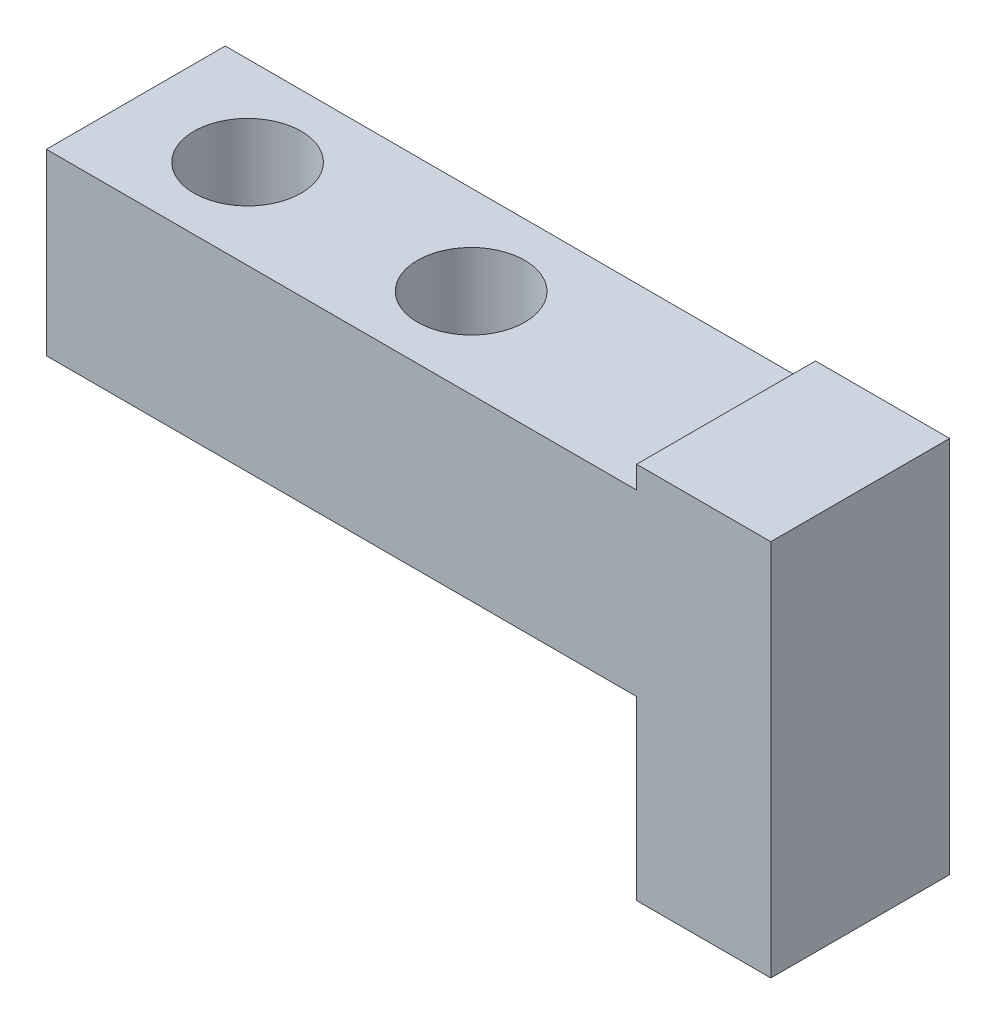
ISO-10303-21;
HEADER;
FILE_DESCRIPTION(('STEP AP214'),'2;1');
FILE_NAME('part.step','',(''),(''),'','','');
FILE_SCHEMA(('AUTOMOTIVE_DESIGN { 1 0 10303 214 1 1 1 1 }'));
ENDSEC;
DATA;
#1=APPLICATION_CONTEXT('core data for automotive mechanical design processes');
#2=APPLICATION_PROTOCOL_DEFINITION('international standard','automotive_design',2000,#1);
#3=PRODUCT_CONTEXT('',#1,'mechanical');
#4=PRODUCT('Part','Part','',(#3));
#5=PRODUCT_RELATED_PRODUCT_CATEGORY('part','',(#4));
#6=PRODUCT_DEFINITION_FORMATION('','',#4);
#7=PRODUCT_DEFINITION_CONTEXT('part definition',#1,'design');
#8=PRODUCT_DEFINITION('design','',#6,#7);
#9=PRODUCT_DEFINITION_SHAPE('','',#8);
#10=(LENGTH_UNIT() NAMED_UNIT(*) SI_UNIT(.MILLI.,.METRE.));
#11=(NAMED_UNIT(*) PLANE_ANGLE_UNIT() SI_UNIT($,.RADIAN.));
#12=(NAMED_UNIT(*) SI_UNIT($,.STERADIAN.) SOLID_ANGLE_UNIT());
#13=UNCERTAINTY_MEASURE_WITH_UNIT(LENGTH_MEASURE(1.E-05),#10,'distance_accuracy_value','');
#14=(GEOMETRIC_REPRESENTATION_CONTEXT(3) GLOBAL_UNCERTAINTY_ASSIGNED_CONTEXT((#13)) GLOBAL_UNIT_ASSIGNED_CONTEXT((#10,
#11,#12)) REPRESENTATION_CONTEXT('',''));
#15=CARTESIAN_POINT('',(0.,0.,0.));
#16=DIRECTION('',(0.,0.,1.));
#17=DIRECTION('',(1.,0.,0.));
#18=AXIS2_PLACEMENT_3D('',#15,#16,#17);
#19=CARTESIAN_POINT('',(-2.99999999999999,4.00000000000017,2.00000000000045));
#20=DIRECTION('',(0.999999999999974,0.,0.));
#21=DIRECTION('',(0.,0.,-0.999999999999992));
#22=AXIS2_PLACEMENT_3D('',#19,#20,#21);
#23=PLANE('',#22);
#24=DIRECTION('',(0.,-0.999999999999992,0.));
#25=VECTOR('',#24,1.);
#26=CARTESIAN_POINT('',(-3.00000000000054,3.99999999999923,-1.99999999999972));
#27=LINE('',#26,#25);
#28=CARTESIAN_POINT('',(-3.00000000000054,4.4999999999995,-2.00000000000011));
#29=VERTEX_POINT('',#28);
#30=CARTESIAN_POINT('',(-3.00000000000054,3.99999999999923,-1.99999999999972));
#31=VERTEX_POINT('',#30);
#32=EDGE_CURVE('E115',#29,#31,#27,.T.);
#33=ORIENTED_EDGE('',*,*,#32,.T.);
#34=DIRECTION('',(0.,0.,-0.999999999999992));
#35=VECTOR('',#34,1.);
#36=CARTESIAN_POINT('',(-2.99999999999999,4.00000000000017,2.00000000000045));
#37=LINE('',#36,#35);
#38=CARTESIAN_POINT('',(-2.99999999999999,4.00000000000017,2.00000000000045));
#39=VERTEX_POINT('',#38);
#40=EDGE_CURVE('E11',#39,#31,#37,.T.);
#41=ORIENTED_EDGE('',*,*,#40,.F.);
#42=DIRECTION('',(0.,-0.999999999999992,0.));
#43=VECTOR('',#42,1.);
#44=CARTESIAN_POINT('',(-2.99999999999999,4.00000000000017,2.00000000000045));
#45=LINE('',#44,#43);
#46=CARTESIAN_POINT('',(-2.99999999999999,4.49999999999956,2.00000000000033));
#47=VERTEX_POINT('',#46);
#48=EDGE_CURVE('E130',#47,#39,#45,.T.);
#49=ORIENTED_EDGE('',*,*,#48,.F.);
#50=DIRECTION('',(0.,0.,-0.999999999999992));
#51=VECTOR('',#50,1.);
#52=CARTESIAN_POINT('',(-2.99999999999999,4.49999999999956,2.00000000000033));
#53=LINE('',#52,#51);
#54=EDGE_CURVE('E111',#47,#29,#53,.T.);
#55=ORIENTED_EDGE('',*,*,#54,.T.);
#56=EDGE_LOOP('',(#33,#41,#49,#55));
#57=FACE_BOUND('',#56,.T.);
#58=ADVANCED_FACE('F17',(#57),#23,.F.);
#59=CARTESIAN_POINT('',(-16.1999999999989,4.00000000000006,2.00000000000017));
#60=DIRECTION('',(0.,-0.999999999999992,0.));
#61=DIRECTION('',(0.999999999999974,0.,0.));
#62=AXIS2_PLACEMENT_3D('',#59,#60,#61);
#63=PLANE('',#62);
#64=CARTESIAN_POINT('',(-8.7,3.99999999999995,-2.77555756156289E-13));
#65=DIRECTION('',(0.,0.999999999999992,0.));
#66=DIRECTION('',(0.,0.,0.999999999999992));
#67=AXIS2_PLACEMENT_3D('',#64,#65,#66);
#68=CIRCLE('',#67,1.2);
#69=CARTESIAN_POINT('',(-8.69999999999997,3.99999999999995,1.20000000000083));
#70=VERTEX_POINT('',#69);
#71=EDGE_CURVE('E150',#70,#70,#68,.T.);
#72=ORIENTED_EDGE('',*,*,#71,.F.);
#73=EDGE_LOOP('',(#72));
#74=FACE_BOUND('',#73,.T.);
#75=CARTESIAN_POINT('',(-13.6999999999995,3.99999999999934,-1.66533453693773E-13));
#76=DIRECTION('',(0.,0.999999999999992,0.));
#77=DIRECTION('',(0.,0.,0.999999999999992));
#78=AXIS2_PLACEMENT_3D('',#75,#76,#77);
#79=CIRCLE('',#78,1.2);
#80=CARTESIAN_POINT('',(-13.6999999999994,3.99999999999934,1.20000000000071));
#81=VERTEX_POINT('',#80);
#82=EDGE_CURVE('E142',#81,#81,#79,.T.);
#83=ORIENTED_EDGE('',*,*,#82,.F.);
#84=EDGE_LOOP('',(#83));
#85=FACE_BOUND('',#84,.T.);
#86=DIRECTION('',(-0.999999999999974,0.,0.));
#87=VECTOR('',#86,1.);
#88=CARTESIAN_POINT('',(-16.2,4.00000000000028,-2.00000000000006));
#89=LINE('',#88,#87);
#90=CARTESIAN_POINT('',(-16.2,4.00000000000028,-2.00000000000006));
#91=VERTEX_POINT('',#90);
#92=EDGE_CURVE('E118',#31,#91,#89,.T.);
#93=ORIENTED_EDGE('',*,*,#92,.T.);
#94=DIRECTION('',(0.,0.,-0.999999999999992));
#95=VECTOR('',#94,1.);
#96=CARTESIAN_POINT('',(-16.1999999999989,4.00000000000006,2.00000000000017));
#97=LINE('',#96,#95);
#98=CARTESIAN_POINT('',(-16.1999999999989,4.00000000000006,2.00000000000017));
#99=VERTEX_POINT('',#98);
#100=EDGE_CURVE('E26',#99,#91,#97,.T.);
#101=ORIENTED_EDGE('',*,*,#100,.F.);
#102=DIRECTION('',(-0.999999999999974,0.,0.));
#103=VECTOR('',#102,1.);
#104=CARTESIAN_POINT('',(-16.1999999999989,4.00000000000006,2.00000000000017));
#105=LINE('',#104,#103);
#106=EDGE_CURVE('E78',#39,#99,#105,.T.);
#107=ORIENTED_EDGE('',*,*,#106,.F.);
#108=ORIENTED_EDGE('',*,*,#40,.T.);
#109=EDGE_LOOP('',(#93,#101,#107,#108));
#110=FACE_BOUND('',#109,.T.);
#111=ADVANCED_FACE('F187',(#74,#85,#110),#63,.F.);
#112=CARTESIAN_POINT('',(-16.2,2.22044604925031E-13,1.99999999999895));
#113=DIRECTION('',(0.999999999999974,0.,0.));
#114=DIRECTION('',(0.,0.,-0.999999999999992));
#115=AXIS2_PLACEMENT_3D('',#112,#113,#114);
#116=PLANE('',#115);
#117=DIRECTION('',(0.,-0.999999999999992,0.));
#118=VECTOR('',#117,1.);
#119=CARTESIAN_POINT('',(-16.2,-1.66533453693773E-13,-1.99999999999984));
#120=LINE('',#119,#118);
#121=CARTESIAN_POINT('',(-16.2,-1.66533453693773E-13,-1.99999999999984));
#122=VERTEX_POINT('',#121);
#123=EDGE_CURVE('E121',#91,#122,#120,.T.);
#124=ORIENTED_EDGE('',*,*,#123,.T.);
#125=DIRECTION('',(0.,0.,-0.999999999999992));
#126=VECTOR('',#125,1.);
#127=CARTESIAN_POINT('',(-16.2,2.22044604925031E-13,1.99999999999895));
#128=LINE('',#127,#126);
#129=CARTESIAN_POINT('',(-16.2,2.22044604925031E-13,1.99999999999895));
#130=VERTEX_POINT('',#129);
#131=EDGE_CURVE('E137',#130,#122,#128,.T.);
#132=ORIENTED_EDGE('',*,*,#131,.F.);
#133=DIRECTION('',(0.,-0.999999999999992,0.));
#134=VECTOR('',#133,1.);
#135=CARTESIAN_POINT('',(-16.2,2.22044604925031E-13,1.99999999999895));
#136=LINE('',#135,#134);
#137=EDGE_CURVE('E155',#99,#130,#136,.T.);
#138=ORIENTED_EDGE('',*,*,#137,.F.);
#139=ORIENTED_EDGE('',*,*,#100,.T.);
#140=EDGE_LOOP('',(#124,#132,#138,#139));
#141=FACE_BOUND('',#140,.T.);
#142=ADVANCED_FACE('F191',(#141),#116,.F.);
#143=CARTESIAN_POINT('',(-3.00000000000054,0.,2.00000000000061));
#144=DIRECTION('',(0.,0.999999999999992,0.));
#145=DIRECTION('',(-0.999999999999974,0.,0.));
#146=AXIS2_PLACEMENT_3D('',#143,#144,#145);
#147=PLANE('',#146);
#148=CARTESIAN_POINT('',(-8.7,0.,0.));
#149=DIRECTION('',(0.,0.999999999999992,0.));
#150=DIRECTION('',(-0.999999999999974,0.,0.));
#151=AXIS2_PLACEMENT_3D('',#148,#149,#150);
#152=CIRCLE('',#151,1.2);
#153=CARTESIAN_POINT('',(-8.69999999999999,0.,1.20000000000082));
#154=VERTEX_POINT('',#153);
#155=EDGE_CURVE('E20',#154,#154,#152,.T.);
#156=ORIENTED_EDGE('',*,*,#155,.T.);
#157=EDGE_LOOP('',(#156));
#158=FACE_BOUND('',#157,.T.);
#159=CARTESIAN_POINT('',(-13.6999999999994,4.44089209850063E-13,-1.11022302462516E-13));
#160=DIRECTION('',(0.,0.999999999999992,0.));
#161=DIRECTION('',(-0.999999999999974,0.,0.));
#162=AXIS2_PLACEMENT_3D('',#159,#160,#161);
#163=CIRCLE('',#162,1.2);
#164=CARTESIAN_POINT('',(-13.6999999999995,4.44089209850063E-13,1.20000000000071));
#165=VERTEX_POINT('',#164);
#166=EDGE_CURVE('E119',#165,#165,#163,.T.);
#167=ORIENTED_EDGE('',*,*,#166,.T.);
#168=EDGE_LOOP('',(#167));
#169=FACE_BOUND('',#168,.T.);
#170=DIRECTION('',(0.999999999999974,0.,0.));
#171=VECTOR('',#170,1.);
#172=CARTESIAN_POINT('',(-3.00000000000053,-1.11022302462516E-13,-1.99999999999945));
#173=LINE('',#172,#171);
#174=CARTESIAN_POINT('',(-3.00000000000053,-1.11022302462516E-13,-1.99999999999945));
#175=VERTEX_POINT('',#174);
#176=EDGE_CURVE('E123',#122,#175,#173,.T.);
#177=ORIENTED_EDGE('',*,*,#176,.T.);
#178=DIRECTION('',(0.,0.,-0.999999999999992));
#179=VECTOR('',#178,1.);
#180=CARTESIAN_POINT('',(-3.00000000000054,0.,2.00000000000061));
#181=LINE('',#180,#179);
#182=CARTESIAN_POINT('',(-3.00000000000054,0.,2.00000000000061));
#183=VERTEX_POINT('',#182);
#184=EDGE_CURVE('E134',#183,#175,#181,.T.);
#185=ORIENTED_EDGE('',*,*,#184,.F.);
#186=DIRECTION('',(0.999999999999974,0.,0.));
#187=VECTOR('',#186,1.);
#188=CARTESIAN_POINT('',(-3.00000000000054,0.,2.00000000000061));
#189=LINE('',#188,#187);
#190=EDGE_CURVE('E157',#130,#183,#189,.T.);
#191=ORIENTED_EDGE('',*,*,#190,.F.);
#192=ORIENTED_EDGE('',*,*,#131,.T.);
#193=EDGE_LOOP('',(#177,#185,#191,#192));
#194=FACE_BOUND('',#193,.T.);
#195=ADVANCED_FACE('F163',(#158,#169,#194),#147,.F.);
#196=CARTESIAN_POINT('',(-3.00000000000053,-3.95000000000023,2.00000000000006));
#197=DIRECTION('',(0.999999999999974,0.,0.));
#198=DIRECTION('',(0.,0.,-0.999999999999992));
#199=AXIS2_PLACEMENT_3D('',#196,#197,#198);
#200=PLANE('',#199);
#201=DIRECTION('',(0.,-0.999999999999992,0.));
#202=VECTOR('',#201,1.);
#203=CARTESIAN_POINT('',(-3.,-3.9499999999994,-1.99999999999995));
#204=LINE('',#203,#202);
#205=CARTESIAN_POINT('',(-3.,-3.9499999999994,-1.99999999999995));
#206=VERTEX_POINT('',#205);
#207=EDGE_CURVE('E125',#175,#206,#204,.T.);
#208=ORIENTED_EDGE('',*,*,#207,.T.);
#209=DIRECTION('',(0.,0.,-0.999999999999992));
#210=VECTOR('',#209,1.);
#211=CARTESIAN_POINT('',(-3.00000000000053,-3.95000000000023,2.00000000000006));
#212=LINE('',#211,#210);
#213=CARTESIAN_POINT('',(-3.00000000000053,-3.95000000000023,2.00000000000006));
#214=VERTEX_POINT('',#213);
#215=EDGE_CURVE('E106',#214,#206,#212,.T.);
#216=ORIENTED_EDGE('',*,*,#215,.F.);
#217=DIRECTION('',(0.,-0.999999999999992,0.));
#218=VECTOR('',#217,1.);
#219=CARTESIAN_POINT('',(-3.00000000000053,-3.95000000000023,2.00000000000006));
#220=LINE('',#219,#218);
#221=EDGE_CURVE('E97',#183,#214,#220,.T.);
#222=ORIENTED_EDGE('',*,*,#221,.F.);
#223=ORIENTED_EDGE('',*,*,#184,.T.);
#224=EDGE_LOOP('',(#208,#216,#222,#223));
#225=FACE_BOUND('',#224,.T.);
#226=ADVANCED_FACE('F167',(#225),#200,.F.);
#227=CARTESIAN_POINT('',(-5.41233724504764E-13,-3.94999999999979,1.99999999999934));
#228=DIRECTION('',(0.,0.999999999999992,0.));
#229=DIRECTION('',(0.,0.,0.999999999999992));
#230=AXIS2_PLACEMENT_3D('',#227,#228,#229);
#231=PLANE('',#230);
#232=DIRECTION('',(0.999999999999974,0.,0.));
#233=VECTOR('',#232,1.);
#234=CARTESIAN_POINT('',(0.,-3.94999999999923,-2.00000000000033));
#235=LINE('',#234,#233);
#236=CARTESIAN_POINT('',(0.,-3.94999999999923,-2.00000000000033));
#237=VERTEX_POINT('',#236);
#238=EDGE_CURVE('E105',#206,#237,#235,.T.);
#239=ORIENTED_EDGE('',*,*,#238,.T.);
#240=DIRECTION('',(0.,0.,-0.999999999999992));
#241=VECTOR('',#240,1.);
#242=CARTESIAN_POINT('',(-5.41233724504764E-13,-3.94999999999979,1.99999999999934));
#243=LINE('',#242,#241);
#244=CARTESIAN_POINT('',(-5.41233724504764E-13,-3.94999999999979,1.99999999999934));
#245=VERTEX_POINT('',#244);
#246=EDGE_CURVE('E102',#245,#237,#243,.T.);
#247=ORIENTED_EDGE('',*,*,#246,.F.);
#248=DIRECTION('',(0.999999999999974,0.,0.));
#249=VECTOR('',#248,1.);
#250=CARTESIAN_POINT('',(-5.41233724504764E-13,-3.94999999999979,1.99999999999934));
#251=LINE('',#250,#249);
#252=EDGE_CURVE('E91',#214,#245,#251,.T.);
#253=ORIENTED_EDGE('',*,*,#252,.F.);
#254=ORIENTED_EDGE('',*,*,#215,.T.);
#255=EDGE_LOOP('',(#239,#247,#253,#254));
#256=FACE_BOUND('',#255,.T.);
#257=ADVANCED_FACE('F103',(#256),#231,.F.);
#258=CARTESIAN_POINT('',(0.,4.49999999999973,1.99999999999906));
#259=DIRECTION('',(-0.999999999999974,0.,0.));
#260=DIRECTION('',(0.,-0.999999999999992,0.));
#261=AXIS2_PLACEMENT_3D('',#258,#259,#260);
#262=PLANE('',#261);
#263=DIRECTION('',(0.,0.999999999999992,0.));
#264=VECTOR('',#263,1.);
#265=CARTESIAN_POINT('',(-5.41233724504764E-13,4.49999999999973,-2.00000000000045));
#266=LINE('',#265,#264);
#267=CARTESIAN_POINT('',(-5.41233724504764E-13,4.49999999999973,-2.00000000000045));
#268=VERTEX_POINT('',#267);
#269=EDGE_CURVE('E64',#237,#268,#266,.T.);
#270=ORIENTED_EDGE('',*,*,#269,.T.);
#271=DIRECTION('',(0.,0.,-0.999999999999992));
#272=VECTOR('',#271,1.);
#273=CARTESIAN_POINT('',(0.,4.49999999999973,1.99999999999906));
#274=LINE('',#273,#272);
#275=CARTESIAN_POINT('',(0.,4.49999999999973,1.99999999999906));
#276=VERTEX_POINT('',#275);
#277=EDGE_CURVE('E107',#276,#268,#274,.T.);
#278=ORIENTED_EDGE('',*,*,#277,.F.);
#279=DIRECTION('',(0.,0.999999999999992,0.));
#280=VECTOR('',#279,1.);
#281=CARTESIAN_POINT('',(0.,4.49999999999973,1.99999999999906));
#282=LINE('',#281,#280);
#283=EDGE_CURVE('E95',#245,#276,#282,.T.);
#284=ORIENTED_EDGE('',*,*,#283,.F.);
#285=ORIENTED_EDGE('',*,*,#246,.T.);
#286=EDGE_LOOP('',(#270,#278,#284,#285));
#287=FACE_BOUND('',#286,.T.);
#288=ADVANCED_FACE('F109',(#287),#262,.F.);
#289=CARTESIAN_POINT('',(-2.99999999999999,4.49999999999956,2.00000000000033));
#290=DIRECTION('',(0.,-0.999999999999992,0.));
#291=DIRECTION('',(0.,0.,-0.999999999999992));
#292=AXIS2_PLACEMENT_3D('',#289,#290,#291);
#293=PLANE('',#292);
#294=DIRECTION('',(-0.999999999999974,0.,0.));
#295=VECTOR('',#294,1.);
#296=CARTESIAN_POINT('',(-3.00000000000054,4.4999999999995,-2.00000000000011));
#297=LINE('',#296,#295);
#298=EDGE_CURVE('E70',#268,#29,#297,.T.);
#299=ORIENTED_EDGE('',*,*,#298,.T.);
#300=ORIENTED_EDGE('',*,*,#54,.F.);
#301=DIRECTION('',(-0.999999999999974,0.,0.));
#302=VECTOR('',#301,1.);
#303=CARTESIAN_POINT('',(-2.99999999999999,4.49999999999956,2.00000000000033));
#304=LINE('',#303,#302);
#305=EDGE_CURVE('E35',#276,#47,#304,.T.);
#306=ORIENTED_EDGE('',*,*,#305,.F.);
#307=ORIENTED_EDGE('',*,*,#277,.T.);
#308=EDGE_LOOP('',(#299,#300,#306,#307));
#309=FACE_BOUND('',#308,.T.);
#310=ADVANCED_FACE('F175',(#309),#293,.F.);
#311=CARTESIAN_POINT('',(-2.99999999999999,4.49999999999956,2.00000000000033));
#312=DIRECTION('',(0.,0.,-0.999999999999992));
#313=DIRECTION('',(-0.999999999999974,0.,0.));
#314=AXIS2_PLACEMENT_3D('',#311,#312,#313);
#315=PLANE('',#314);
#316=ORIENTED_EDGE('',*,*,#48,.T.);
#317=ORIENTED_EDGE('',*,*,#106,.T.);
#318=ORIENTED_EDGE('',*,*,#137,.T.);
#319=ORIENTED_EDGE('',*,*,#190,.T.);
#320=ORIENTED_EDGE('',*,*,#221,.T.);
#321=ORIENTED_EDGE('',*,*,#252,.T.);
#322=ORIENTED_EDGE('',*,*,#283,.T.);
#323=ORIENTED_EDGE('',*,*,#305,.T.);
#324=EDGE_LOOP('',(#316,#317,#318,#319,#320,#321,#322,#323));
#325=FACE_BOUND('',#324,.T.);
#326=ADVANCED_FACE('F93',(#325),#315,.F.);
#327=CARTESIAN_POINT('',(-3.00000000000054,4.4999999999995,-2.00000000000011));
#328=DIRECTION('',(0.,0.,-0.999999999999992));
#329=DIRECTION('',(-0.999999999999974,0.,0.));
#330=AXIS2_PLACEMENT_3D('',#327,#328,#329);
#331=PLANE('',#330);
#332=ORIENTED_EDGE('',*,*,#32,.F.);
#333=ORIENTED_EDGE('',*,*,#298,.F.);
#334=ORIENTED_EDGE('',*,*,#269,.F.);
#335=ORIENTED_EDGE('',*,*,#238,.F.);
#336=ORIENTED_EDGE('',*,*,#207,.F.);
#337=ORIENTED_EDGE('',*,*,#176,.F.);
#338=ORIENTED_EDGE('',*,*,#123,.F.);
#339=ORIENTED_EDGE('',*,*,#92,.F.);
#340=EDGE_LOOP('',(#332,#333,#334,#335,#336,#337,#338,#339));
#341=FACE_BOUND('',#340,.T.);
#342=ADVANCED_FACE('F170',(#341),#331,.T.);
#343=CARTESIAN_POINT('',(-13.6999999999995,-3.94999999999973,7.21644966006352E-13));
#344=DIRECTION('',(0.,0.999999999999992,0.));
#345=DIRECTION('',(0.,0.,0.999999999999992));
#346=AXIS2_PLACEMENT_3D('',#343,#344,#345);
#347=CYLINDRICAL_SURFACE('',#346,1.2);
#348=CARTESIAN_POINT('',(-13.6999999999994,3.99999999999934,1.20000000000071));
#349=CARTESIAN_POINT('',(-13.6999999999994,3.95833333333268,1.20000000000071));
#350=CARTESIAN_POINT('',(-13.6999999999994,3.91666666666603,1.20000000000071));
#351=CARTESIAN_POINT('',(-13.6999999999994,3.83333333333272,1.20000000000071));
#352=CARTESIAN_POINT('',(-13.6999999999994,3.79166666666606,1.20000000000071));
#353=CARTESIAN_POINT('',(-13.6999999999994,3.70833333333275,1.20000000000071));
#354=CARTESIAN_POINT('',(-13.6999999999994,3.6666666666661,1.20000000000071));
#355=CARTESIAN_POINT('',(-13.6999999999994,3.58333333333279,1.20000000000071));
#356=CARTESIAN_POINT('',(-13.6999999999994,3.54166666666613,1.20000000000071));
#357=CARTESIAN_POINT('',(-13.6999999999994,3.45833333333282,1.20000000000071));
#358=CARTESIAN_POINT('',(-13.6999999999994,3.41666666666616,1.20000000000071));
#359=CARTESIAN_POINT('',(-13.6999999999994,3.33333333333285,1.20000000000071));
#360=CARTESIAN_POINT('',(-13.6999999999994,3.2916666666662,1.20000000000071));
#361=CARTESIAN_POINT('',(-13.6999999999994,3.20833333333289,1.20000000000071));
#362=CARTESIAN_POINT('',(-13.6999999999994,3.16666666666623,1.20000000000071));
#363=CARTESIAN_POINT('',(-13.6999999999994,3.08333333333292,1.20000000000071));
#364=CARTESIAN_POINT('',(-13.6999999999994,3.04166666666627,1.20000000000071));
#365=CARTESIAN_POINT('',(-13.6999999999994,2.95833333333296,1.20000000000071));
#366=CARTESIAN_POINT('',(-13.6999999999994,2.9166666666663,1.20000000000071));
#367=CARTESIAN_POINT('',(-13.6999999999994,2.83333333333299,1.20000000000071));
#368=CARTESIAN_POINT('',(-13.6999999999994,2.79166666666634,1.20000000000071));
#369=CARTESIAN_POINT('',(-13.6999999999994,2.70833333333303,1.20000000000071));
#370=CARTESIAN_POINT('',(-13.6999999999994,2.66666666666637,1.20000000000071));
#371=CARTESIAN_POINT('',(-13.6999999999994,2.58333333333306,1.20000000000071));
#372=CARTESIAN_POINT('',(-13.6999999999994,2.54166666666641,1.20000000000071));
#373=CARTESIAN_POINT('',(-13.6999999999994,2.4583333333331,1.20000000000071));
#374=CARTESIAN_POINT('',(-13.6999999999994,2.41666666666644,1.20000000000071));
#375=CARTESIAN_POINT('',(-13.6999999999994,2.33333333333313,1.20000000000071));
#376=CARTESIAN_POINT('',(-13.6999999999994,2.29166666666648,1.20000000000071));
#377=CARTESIAN_POINT('',(-13.6999999999994,2.20833333333317,1.20000000000071));
#378=CARTESIAN_POINT('',(-13.6999999999994,2.16666666666651,1.20000000000071));
#379=CARTESIAN_POINT('',(-13.6999999999994,2.0833333333332,1.20000000000071));
#380=CARTESIAN_POINT('',(-13.6999999999994,2.04166666666654,1.20000000000071));
#381=CARTESIAN_POINT('',(-13.6999999999994,1.95833333333323,1.20000000000071));
#382=CARTESIAN_POINT('',(-13.6999999999994,1.91666666666658,1.20000000000071));
#383=CARTESIAN_POINT('',(-13.6999999999994,1.83333333333327,1.20000000000071));
#384=CARTESIAN_POINT('',(-13.6999999999994,1.79166666666661,1.20000000000071));
#385=CARTESIAN_POINT('',(-13.6999999999994,1.7083333333333,1.20000000000071));
#386=CARTESIAN_POINT('',(-13.6999999999994,1.66666666666665,1.20000000000071));
#387=CARTESIAN_POINT('',(-13.6999999999994,1.58333333333334,1.20000000000071));
#388=CARTESIAN_POINT('',(-13.6999999999994,1.54166666666668,1.20000000000071));
#389=CARTESIAN_POINT('',(-13.6999999999994,1.45833333333337,1.20000000000071));
#390=CARTESIAN_POINT('',(-13.6999999999994,1.41666666666672,1.20000000000071));
#391=CARTESIAN_POINT('',(-13.6999999999994,1.33333333333341,1.20000000000071));
#392=CARTESIAN_POINT('',(-13.6999999999994,1.29166666666675,1.20000000000071));
#393=CARTESIAN_POINT('',(-13.6999999999994,1.20833333333344,1.20000000000071));
#394=CARTESIAN_POINT('',(-13.6999999999994,1.16666666666679,1.20000000000071));
#395=CARTESIAN_POINT('',(-13.6999999999994,1.08333333333348,1.20000000000071));
#396=CARTESIAN_POINT('',(-13.6999999999994,1.04166666666682,1.20000000000071));
#397=CARTESIAN_POINT('',(-13.6999999999994,0.958333333333512,1.20000000000071));
#398=CARTESIAN_POINT('',(-13.6999999999994,0.916666666666857,1.20000000000071));
#399=CARTESIAN_POINT('',(-13.6999999999994,0.833333333333547,1.20000000000071));
#400=CARTESIAN_POINT('',(-13.6999999999995,0.791666666666892,1.20000000000071));
#401=CARTESIAN_POINT('',(-13.6999999999995,0.708333333333582,1.20000000000071));
#402=CARTESIAN_POINT('',(-13.6999999999995,0.666666666666926,1.20000000000071));
#403=CARTESIAN_POINT('',(-13.6999999999995,0.583333333333616,1.20000000000071));
#404=CARTESIAN_POINT('',(-13.6999999999995,0.54166666666696,1.20000000000071));
#405=CARTESIAN_POINT('',(-13.6999999999995,0.45833333333365,1.20000000000071));
#406=CARTESIAN_POINT('',(-13.6999999999995,0.416666666666995,1.20000000000071));
#407=CARTESIAN_POINT('',(-13.6999999999995,0.333333333333685,1.20000000000071));
#408=CARTESIAN_POINT('',(-13.6999999999995,0.291666666667029,1.20000000000071));
#409=CARTESIAN_POINT('',(-13.6999999999995,0.208333333333719,1.20000000000071));
#410=CARTESIAN_POINT('',(-13.6999999999995,0.166666666667064,1.20000000000071));
#411=CARTESIAN_POINT('',(-13.6999999999995,0.0833333333337538,1.20000000000071));
#412=CARTESIAN_POINT('',(-13.6999999999995,0.041666666667099,1.20000000000071));
#413=CARTESIAN_POINT('',(-13.6999999999995,4.44089209850063E-13,1.20000000000071));
#414=B_SPLINE_CURVE_WITH_KNOTS('',3,(#348,#349,#350,#351,#352,#353,#354,#355,#356,#357,#358,
#359,#360,#361,#362,#363,#364,#365,#366,#367,#368,#369,#370,#371,#372,#373,#374,#375,#376,#377,
#378,#379,#380,#381,#382,#383,#384,#385,#386,#387,#388,#389,#390,#391,#392,#393,#394,#395,#396,
#397,#398,#399,#400,#401,#402,#403,#404,#405,#406,#407,#408,#409,#410,#411,#412,#413),
.UNSPECIFIED.,.F.,.F.,(4,2,2,2,2,2,2,2,2,2,2,2,2,2,2,2,2,2,2,2,2,2,2,2,2,2,2,2,2,2,2,2,4),(0.,
0.124999999999965,0.24999999999993,0.374999999999895,0.499999999999861,0.624999999999827,
0.749999999999792,0.874999999999757,0.999999999999722,1.12499999999969,1.24999999999965,
1.37499999999962,1.49999999999958,1.62499999999955,1.74999999999952,1.87499999999948,
1.99999999999945,2.12499999999941,2.24999999999938,2.37499999999934,2.49999999999931,
2.62499999999927,2.74999999999924,2.8749999999992,2.99999999999917,3.12499999999913,
3.2499999999991,3.37499999999906,3.49999999999903,3.624999999999,3.74999999999896,
3.87499999999893,3.99999999999889),.UNSPECIFIED.);
#415=EDGE_CURVE('BSEAM232',#81,#165,#414,.T.);
#416=ORIENTED_EDGE('',*,*,#82,.T.);
#417=ORIENTED_EDGE('',*,*,#166,.F.);
#418=ORIENTED_EDGE('',*,*,#415,.T.);
#419=ORIENTED_EDGE('',*,*,#415,.F.);
#420=EDGE_LOOP('',(#416,#418,#417,#419));
#421=FACE_BOUND('',#420,.T.);
#422=ADVANCED_FACE('F232',(#421),#347,.F.);
#423=CARTESIAN_POINT('',(-8.7,-3.9499999999999,8.32667268468867E-13));
#424=DIRECTION('',(0.,0.999999999999992,0.));
#425=DIRECTION('',(0.,0.,0.999999999999992));
#426=AXIS2_PLACEMENT_3D('',#423,#424,#425);
#427=CYLINDRICAL_SURFACE('',#426,1.2);
#428=CARTESIAN_POINT('',(-8.69999999999997,3.99999999999995,1.20000000000083));
#429=CARTESIAN_POINT('',(-8.69999999999997,3.95833333333328,1.20000000000083));
#430=CARTESIAN_POINT('',(-8.69999999999997,3.91666666666661,1.20000000000083));
#431=CARTESIAN_POINT('',(-8.69999999999997,3.83333333333328,1.20000000000083));
#432=CARTESIAN_POINT('',(-8.69999999999997,3.79166666666662,1.20000000000083));
#433=CARTESIAN_POINT('',(-8.69999999999997,3.70833333333328,1.20000000000083));
#434=CARTESIAN_POINT('',(-8.69999999999997,3.66666666666662,1.20000000000083));
#435=CARTESIAN_POINT('',(-8.69999999999997,3.58333333333329,1.20000000000083));
#436=CARTESIAN_POINT('',(-8.69999999999997,3.54166666666662,1.20000000000083));
#437=CARTESIAN_POINT('',(-8.69999999999997,3.45833333333329,1.20000000000083));
#438=CARTESIAN_POINT('',(-8.69999999999997,3.41666666666662,1.20000000000083));
#439=CARTESIAN_POINT('',(-8.69999999999997,3.33333333333329,1.20000000000083));
#440=CARTESIAN_POINT('',(-8.69999999999997,3.29166666666662,1.20000000000083));
#441=CARTESIAN_POINT('',(-8.69999999999997,3.20833333333329,1.20000000000083));
#442=CARTESIAN_POINT('',(-8.69999999999997,3.16666666666662,1.20000000000083));
#443=CARTESIAN_POINT('',(-8.69999999999997,3.08333333333329,1.20000000000083));
#444=CARTESIAN_POINT('',(-8.69999999999997,3.04166666666663,1.20000000000083));
#445=CARTESIAN_POINT('',(-8.69999999999997,2.95833333333329,1.20000000000083));
#446=CARTESIAN_POINT('',(-8.69999999999997,2.91666666666663,1.20000000000083));
#447=CARTESIAN_POINT('',(-8.69999999999997,2.8333333333333,1.20000000000083));
#448=CARTESIAN_POINT('',(-8.69999999999998,2.79166666666663,1.20000000000083));
#449=CARTESIAN_POINT('',(-8.69999999999998,2.7083333333333,1.20000000000083));
#450=CARTESIAN_POINT('',(-8.69999999999998,2.66666666666663,1.20000000000083));
#451=CARTESIAN_POINT('',(-8.69999999999998,2.5833333333333,1.20000000000083));
#452=CARTESIAN_POINT('',(-8.69999999999998,2.54166666666663,1.20000000000083));
#453=CARTESIAN_POINT('',(-8.69999999999998,2.4583333333333,1.20000000000083));
#454=CARTESIAN_POINT('',(-8.69999999999998,2.41666666666663,1.20000000000082));
#455=CARTESIAN_POINT('',(-8.69999999999998,2.3333333333333,1.20000000000082));
#456=CARTESIAN_POINT('',(-8.69999999999998,2.29166666666664,1.20000000000082));
#457=CARTESIAN_POINT('',(-8.69999999999998,2.2083333333333,1.20000000000082));
#458=CARTESIAN_POINT('',(-8.69999999999998,2.16666666666664,1.20000000000082));
#459=CARTESIAN_POINT('',(-8.69999999999998,2.08333333333331,1.20000000000082));
#460=CARTESIAN_POINT('',(-8.69999999999998,2.04166666666664,1.20000000000082));
#461=CARTESIAN_POINT('',(-8.69999999999998,1.95833333333331,1.20000000000082));
#462=CARTESIAN_POINT('',(-8.69999999999998,1.91666666666664,1.20000000000082));
#463=CARTESIAN_POINT('',(-8.69999999999998,1.83333333333331,1.20000000000082));
#464=CARTESIAN_POINT('',(-8.69999999999998,1.79166666666664,1.20000000000082));
#465=CARTESIAN_POINT('',(-8.69999999999998,1.70833333333331,1.20000000000082));
#466=CARTESIAN_POINT('',(-8.69999999999998,1.66666666666664,1.20000000000082));
#467=CARTESIAN_POINT('',(-8.69999999999998,1.58333333333331,1.20000000000082));
#468=CARTESIAN_POINT('',(-8.69999999999998,1.54166666666665,1.20000000000082));
#469=CARTESIAN_POINT('',(-8.69999999999998,1.45833333333331,1.20000000000082));
#470=CARTESIAN_POINT('',(-8.69999999999998,1.41666666666665,1.20000000000082));
#471=CARTESIAN_POINT('',(-8.69999999999998,1.33333333333332,1.20000000000082));
#472=CARTESIAN_POINT('',(-8.69999999999998,1.29166666666665,1.20000000000082));
#473=CARTESIAN_POINT('',(-8.69999999999998,1.20833333333332,1.20000000000082));
#474=CARTESIAN_POINT('',(-8.69999999999999,1.16666666666665,1.20000000000082));
#475=CARTESIAN_POINT('',(-8.69999999999999,1.08333333333332,1.20000000000082));
#476=CARTESIAN_POINT('',(-8.69999999999999,1.04166666666665,1.20000000000082));
#477=CARTESIAN_POINT('',(-8.69999999999999,0.95833333333332,1.20000000000082));
#478=CARTESIAN_POINT('',(-8.69999999999999,0.916666666666655,1.20000000000082));
#479=CARTESIAN_POINT('',(-8.69999999999999,0.833333333333322,1.20000000000082));
#480=CARTESIAN_POINT('',(-8.69999999999999,0.791666666666656,1.20000000000082));
#481=CARTESIAN_POINT('',(-8.69999999999999,0.708333333333324,1.20000000000082));
#482=CARTESIAN_POINT('',(-8.69999999999999,0.666666666666658,1.20000000000082));
#483=CARTESIAN_POINT('',(-8.69999999999999,0.583333333333325,1.20000000000082));
#484=CARTESIAN_POINT('',(-8.69999999999999,0.541666666666659,1.20000000000082));
#485=CARTESIAN_POINT('',(-8.69999999999999,0.458333333333327,1.20000000000082));
#486=CARTESIAN_POINT('',(-8.69999999999999,0.416666666666661,1.20000000000082));
#487=CARTESIAN_POINT('',(-8.69999999999999,0.333333333333329,1.20000000000082));
#488=CARTESIAN_POINT('',(-8.69999999999999,0.291666666666662,1.20000000000082));
#489=CARTESIAN_POINT('',(-8.69999999999999,0.20833333333333,1.20000000000082));
#490=CARTESIAN_POINT('',(-8.69999999999999,0.166666666666664,1.20000000000082));
#491=CARTESIAN_POINT('',(-8.69999999999999,0.0833333333333317,1.20000000000082));
#492=CARTESIAN_POINT('',(-8.69999999999999,0.0416666666666659,1.20000000000082));
#493=CARTESIAN_POINT('',(-8.69999999999999,0.,1.20000000000082));
#494=B_SPLINE_CURVE_WITH_KNOTS('',3,(#428,#429,#430,#431,#432,#433,#434,#435,#436,#437,#438,
#439,#440,#441,#442,#443,#444,#445,#446,#447,#448,#449,#450,#451,#452,#453,#454,#455,#456,#457,
#458,#459,#460,#461,#462,#463,#464,#465,#466,#467,#468,#469,#470,#471,#472,#473,#474,#475,#476,
#477,#478,#479,#480,#481,#482,#483,#484,#485,#486,#487,#488,#489,#490,#491,#492,#493),
.UNSPECIFIED.,.F.,.F.,(4,2,2,2,2,2,2,2,2,2,2,2,2,2,2,2,2,2,2,2,2,2,2,2,2,2,2,2,2,2,2,2,4),(0.,
0.124999999999998,0.249999999999996,0.374999999999994,0.499999999999993,0.624999999999992,
0.749999999999989,0.874999999999988,0.999999999999986,1.12499999999998,1.24999999999998,
1.37499999999998,1.49999999999998,1.62499999999998,1.74999999999998,1.87499999999997,
1.99999999999997,2.12499999999997,2.24999999999997,2.37499999999997,2.49999999999997,
2.62499999999996,2.74999999999996,2.87499999999996,2.99999999999996,3.12499999999996,
3.24999999999996,3.37499999999995,3.49999999999995,3.62499999999995,3.74999999999995,
3.87499999999995,3.99999999999995),.UNSPECIFIED.);
#495=EDGE_CURVE('BSEAM238',#70,#154,#494,.T.);
#496=ORIENTED_EDGE('',*,*,#71,.T.);
#497=ORIENTED_EDGE('',*,*,#155,.F.);
#498=ORIENTED_EDGE('',*,*,#495,.T.);
#499=ORIENTED_EDGE('',*,*,#495,.F.);
#500=EDGE_LOOP('',(#496,#498,#497,#499));
#501=FACE_BOUND('',#500,.T.);
#502=ADVANCED_FACE('F238',(#501),#427,.F.);
#503=CLOSED_SHELL('',(#58,#111,#142,#195,#226,#257,#288,#310,#326,#342,#422,#502));
#504=MANIFOLD_SOLID_BREP('B1',#503);
#505=ADVANCED_BREP_SHAPE_REPRESENTATION('',(#18,#504),#14);
#506=SHAPE_DEFINITION_REPRESENTATION(#9,#505);
ENDSEC;
END-ISO-10303-21;
